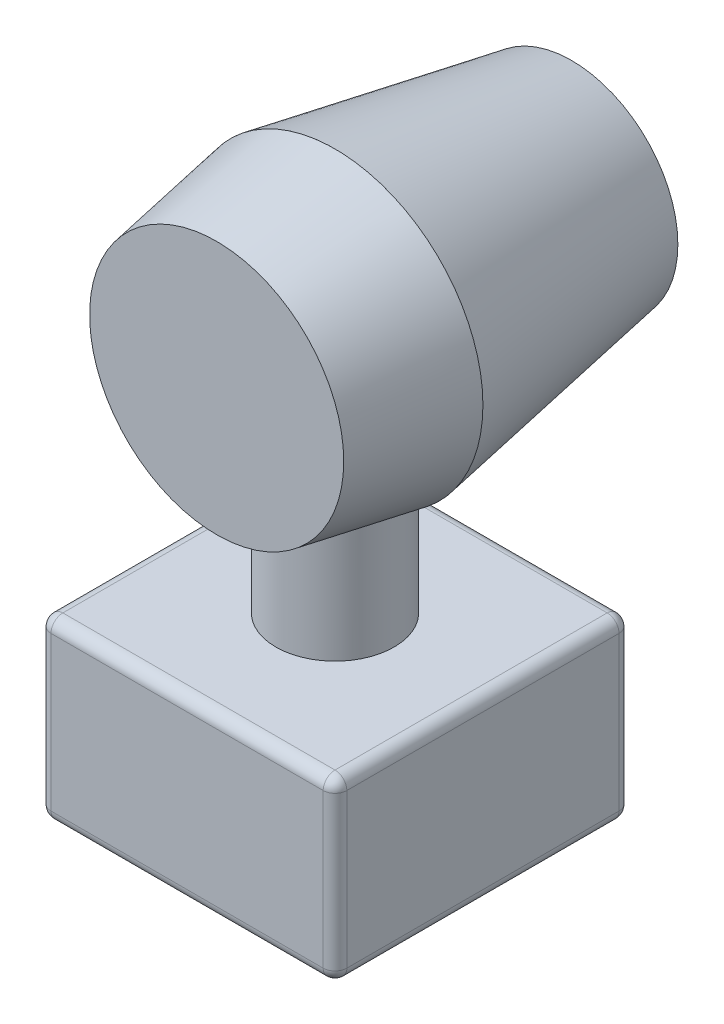
ISO-10303-21;
HEADER;
FILE_DESCRIPTION(('STEP AP214'),'2;1');
FILE_NAME('part.step','',(''),(''),'','','');
FILE_SCHEMA(('AUTOMOTIVE_DESIGN { 1 0 10303 214 1 1 1 1 }'));
ENDSEC;
DATA;
#1=APPLICATION_CONTEXT('core data for automotive mechanical design processes');
#2=APPLICATION_PROTOCOL_DEFINITION('international standard','automotive_design',2000,#1);
#3=PRODUCT_CONTEXT('',#1,'mechanical');
#4=PRODUCT('Part','Part','',(#3));
#5=PRODUCT_RELATED_PRODUCT_CATEGORY('part','',(#4));
#6=PRODUCT_DEFINITION_FORMATION('','',#4);
#7=PRODUCT_DEFINITION_CONTEXT('part definition',#1,'design');
#8=PRODUCT_DEFINITION('design','',#6,#7);
#9=PRODUCT_DEFINITION_SHAPE('','',#8);
#10=(LENGTH_UNIT() NAMED_UNIT(*) SI_UNIT(.MILLI.,.METRE.));
#11=(NAMED_UNIT(*) PLANE_ANGLE_UNIT() SI_UNIT($,.RADIAN.));
#12=(NAMED_UNIT(*) SI_UNIT($,.STERADIAN.) SOLID_ANGLE_UNIT());
#13=UNCERTAINTY_MEASURE_WITH_UNIT(LENGTH_MEASURE(1.E-05),#10,'distance_accuracy_value','');
#14=(GEOMETRIC_REPRESENTATION_CONTEXT(3) GLOBAL_UNCERTAINTY_ASSIGNED_CONTEXT((#13)) GLOBAL_UNIT_ASSIGNED_CONTEXT((#10,
#11,#12)) REPRESENTATION_CONTEXT('',''));
#15=CARTESIAN_POINT('',(0.,0.,0.));
#16=DIRECTION('',(0.,0.,1.));
#17=DIRECTION('',(1.,0.,0.));
#18=AXIS2_PLACEMENT_3D('',#15,#16,#17);
#19=CARTESIAN_POINT('',(0.,73.5493556629696,0.));
#20=DIRECTION('',(0.,0.,-1.));
#21=DIRECTION('',(1.,0.,0.));
#22=AXIS2_PLACEMENT_3D('',#19,#20,#21);
#23=CONICAL_SURFACE('',#22,31.75,0.174532925199433);
#24=CARTESIAN_POINT('',(0.,73.5493556629696,25.4));
#25=DIRECTION('',(0.,0.,1.));
#26=DIRECTION('',(1.,0.,0.));
#27=AXIS2_PLACEMENT_3D('',#24,#25,#26);
#28=CIRCLE('',#27,27.271294690005);
#29=CARTESIAN_POINT('',(27.271294690005,73.5493556629696,25.4));
#30=VERTEX_POINT('',#29);
#31=EDGE_CURVE('E11',#30,#30,#28,.T.);
#32=ORIENTED_EDGE('',*,*,#31,.F.);
#33=EDGE_LOOP('',(#32));
#34=FACE_BOUND('',#33,.T.);
#35=CARTESIAN_POINT('',(0.,73.5493556629696,0.));
#36=DIRECTION('',(0.,0.,1.));
#37=DIRECTION('',(1.,0.,0.));
#38=AXIS2_PLACEMENT_3D('',#35,#36,#37);
#39=CIRCLE('',#38,31.75);
#40=CARTESIAN_POINT('',(31.75,73.5493556629696,0.));
#41=VERTEX_POINT('',#40);
#42=EDGE_CURVE('E50',#41,#41,#39,.T.);
#43=ORIENTED_EDGE('',*,*,#42,.T.);
#44=EDGE_LOOP('',(#43));
#45=FACE_BOUND('',#44,.T.);
#46=ADVANCED_FACE('F44',(#34,#45),#23,.T.);
#47=CARTESIAN_POINT('',(0.,73.5493556629696,25.4));
#48=DIRECTION('',(0.,0.,1.));
#49=DIRECTION('',(1.,0.,0.));
#50=AXIS2_PLACEMENT_3D('',#47,#48,#49);
#51=PLANE('',#50);
#52=ORIENTED_EDGE('',*,*,#31,.T.);
#53=EDGE_LOOP('',(#52));
#54=FACE_BOUND('',#53,.T.);
#55=ADVANCED_FACE('F59',(#54),#51,.T.);
#56=CARTESIAN_POINT('',(0.,73.5493556629696,0.));
#57=DIRECTION('',(0.,0.,1.));
#58=DIRECTION('',(1.,0.,0.));
#59=AXIS2_PLACEMENT_3D('',#56,#57,#58);
#60=PLANE('',#59);
#61=ORIENTED_EDGE('',*,*,#42,.F.);
#62=EDGE_LOOP('',(#61));
#63=FACE_BOUND('',#62,.T.);
#64=ADVANCED_FACE('F57',(#63),#60,.F.);
#65=CLOSED_SHELL('',(#46,#55,#64));
#66=MANIFOLD_SOLID_BREP('B2',#65);
#67=CARTESIAN_POINT('',(0.,44.45,0.));
#68=DIRECTION('',(0.,1.,0.));
#69=DIRECTION('',(0.,0.,1.));
#70=AXIS2_PLACEMENT_3D('',#67,#68,#69);
#71=PLANE('',#70);
#72=CARTESIAN_POINT('',(19.002598434423,44.45,17.0390379885484));
#73=CARTESIAN_POINT('',(18.8235356701978,44.45,16.4838013348454));
#74=CARTESIAN_POINT('',(18.642875072393,44.45,15.9290807569523));
#75=CARTESIAN_POINT('',(18.2780705163189,44.45,14.8207795652394));
#76=CARTESIAN_POINT('',(18.0939265186836,44.45,14.267198964381));
#77=CARTESIAN_POINT('',(17.5356748101558,44.45,12.6078447674147));
#78=CARTESIAN_POINT('',(17.1559097199762,44.45,11.5039639724346));
#79=CARTESIAN_POINT('',(16.3712624910679,44.45,9.28229765231973));
#80=CARTESIAN_POINT('',(15.9660469235655,44.45,8.164629646743));
#81=CARTESIAN_POINT('',(15.1330443252617,44.45,5.93809957608098));
#82=CARTESIAN_POINT('',(14.7052648210868,44.45,4.82923471477085));
#83=CARTESIAN_POINT('',(14.0184426799052,44.45,3.11491452753809));
#84=CARTESIAN_POINT('',(13.7692380362429,44.45,2.50551509840848));
#85=CARTESIAN_POINT('',(13.2608116624823,44.45,1.29091564782306));
#86=CARTESIAN_POINT('',(13.0015901911441,44.45,0.685715518364401));
#87=CARTESIAN_POINT('',(12.4712439026292,44.45,-0.52029155772349));
#88=CARTESIAN_POINT('',(12.2001057240587,44.45,-1.12109264395197));
#89=CARTESIAN_POINT('',(11.6442031587002,44.45,-2.31634300503786));
#90=CARTESIAN_POINT('',(11.3594394831188,44.45,-2.91079260944496));
#91=CARTESIAN_POINT('',(10.7762146568556,44.45,-4.08654798742546));
#92=CARTESIAN_POINT('',(10.4778937305381,44.45,-4.66792304330012));
#93=CARTESIAN_POINT('',(9.86187387577617,44.45,-5.82056092326622));
#94=CARTESIAN_POINT('',(9.54417044593393,44.45,-6.39182135828593));
#95=CARTESIAN_POINT('',(8.88560430627156,44.45,-7.51935040451065));
#96=CARTESIAN_POINT('',(8.54478970730672,44.45,-8.07564698522348));
#97=CARTESIAN_POINT('',(7.83334417474321,44.45,-9.16872353177244));
#98=CARTESIAN_POINT('',(7.462732164141,44.45,-9.70551557441954));
#99=CARTESIAN_POINT('',(6.98345025852729,44.45,-10.3474341204733));
#100=CARTESIAN_POINT('',(6.89310450685243,44.45,-10.4663161320871));
#101=CARTESIAN_POINT('',(6.7102180950632,44.45,-10.7023918496696));
#102=CARTESIAN_POINT('',(6.61767730027151,44.45,-10.8195854513328));
#103=CARTESIAN_POINT('',(6.33649880558963,44.45,-11.1684425834167));
#104=CARTESIAN_POINT('',(6.14435919927044,44.45,-11.3973093976489));
#105=CARTESIAN_POINT('',(5.74989217261827,44.45,-11.8452450865516));
#106=CARTESIAN_POINT('',(5.54758782538117,44.45,-12.0643341935769));
#107=CARTESIAN_POINT('',(5.13095232315342,44.45,-12.4907672109988));
#108=CARTESIAN_POINT('',(4.91662355464813,44.45,-12.6981134357036));
#109=CARTESIAN_POINT('',(4.5192066936559,44.45,-13.0571388538163));
#110=CARTESIAN_POINT('',(4.3386222995621,44.45,-13.2115671284371));
#111=CARTESIAN_POINT('',(3.96798576401039,44.45,-13.5085804429791));
#112=CARTESIAN_POINT('',(3.77793131766287,44.45,-13.6511625769547));
#113=CARTESIAN_POINT('',(3.19317147870125,44.45,-14.0563864733166));
#114=CARTESIAN_POINT('',(2.78263175225813,44.45,-14.2976723554713));
#115=CARTESIAN_POINT('',(2.06614852418224,44.45,-14.6249236437101));
#116=CARTESIAN_POINT('',(1.77168356714644,44.45,-14.7358250064446));
#117=CARTESIAN_POINT('',(1.16858426735958,44.45,-14.9083229723135));
#118=CARTESIAN_POINT('',(0.859969405831298,44.45,-14.9699853316713));
#119=CARTESIAN_POINT('',(0.234584305056036,44.45,-15.0367489482161));
#120=CARTESIAN_POINT('',(-0.0822239178371466,44.45,-15.0415065347739));
#121=CARTESIAN_POINT('',(-0.711398138640903,44.45,-14.992909222197));
#122=CARTESIAN_POINT('',(-1.0237606384265,44.45,-14.9395108748984));
#123=CARTESIAN_POINT('',(-1.68871762676761,44.45,-14.76744423248));
#124=CARTESIAN_POINT('',(-2.03870800883725,44.45,-14.6389363686106));
#125=CARTESIAN_POINT('',(-2.71350949733138,44.45,-14.3276448374468));
#126=CARTESIAN_POINT('',(-3.03827056358923,44.45,-14.1447566117743));
#127=CARTESIAN_POINT('',(-3.61753903498474,44.45,-13.7690139972569));
#128=CARTESIAN_POINT('',(-3.87546298373163,44.45,-13.5812933482752));
#129=CARTESIAN_POINT('',(-4.37428668507126,44.45,-13.1842638341636));
#130=CARTESIAN_POINT('',(-4.6151723541688,44.45,-12.9749374536329));
#131=CARTESIAN_POINT('',(-5.08237564353212,44.45,-12.5394656587436));
#132=CARTESIAN_POINT('',(-5.30864898790133,44.45,-12.3132732269763));
#133=CARTESIAN_POINT('',(-5.74776332590007,44.45,-11.8484622124256));
#134=CARTESIAN_POINT('',(-5.9606092458098,44.45,-11.609848246215));
#135=CARTESIAN_POINT('',(-6.50261079616479,44.45,-10.9725455899704));
#136=CARTESIAN_POINT('',(-6.82246527119225,44.45,-10.5659617006645));
#137=CARTESIAN_POINT('',(-7.43817192412713,44.45,-9.73489068181692));
#138=CARTESIAN_POINT('',(-7.73400942356082,44.45,-9.31039284107437));
#139=CARTESIAN_POINT('',(-8.3066428327371,44.45,-8.44750077930655));
#140=CARTESIAN_POINT('',(-8.58339644577073,44.45,-8.00907864937679));
#141=CARTESIAN_POINT('',(-9.12053275086414,44.45,-7.12251259445784));
#142=CARTESIAN_POINT('',(-9.38091907271994,44.45,-6.67437085486298));
#143=CARTESIAN_POINT('',(-9.89010350026338,44.45,-5.76672526820276));
#144=CARTESIAN_POINT('',(-10.1387885415585,44.45,-5.30715825071471));
#145=CARTESIAN_POINT('',(-10.624356797639,44.45,-4.38182601774382));
#146=CARTESIAN_POINT('',(-10.8612394588333,44.45,-3.91606051281661));
#147=CARTESIAN_POINT('',(-11.324545280009,44.45,-2.98010944294724));
#148=CARTESIAN_POINT('',(-11.5509814026551,44.45,-2.50993027750393));
#149=CARTESIAN_POINT('',(-11.9950352505992,44.45,-1.56542057686625));
#150=CARTESIAN_POINT('',(-12.2126527158999,44.45,-1.09108991977561));
#151=CARTESIAN_POINT('',(-12.7531247828579,44.45,0.112654821795878));
#152=CARTESIAN_POINT('',(-13.070811583501,44.45,0.844389390425289));
#153=CARTESIAN_POINT('',(-13.6911454543776,44.45,2.3142089353253));
#154=CARTESIAN_POINT('',(-13.993791921178,44.45,3.05229416499927));
#155=CARTESIAN_POINT('',(-14.5865217695328,44.45,4.53404785641916));
#156=CARTESIAN_POINT('',(-14.8765966967587,44.45,5.27771969255583));
#157=CARTESIAN_POINT('',(-15.4457774420459,44.45,6.76924945936397));
#158=CARTESIAN_POINT('',(-15.7248831305279,44.45,7.51710743936702));
#159=CARTESIAN_POINT('',(-16.2649616723054,44.45,8.99281338744412));
#160=CARTESIAN_POINT('',(-16.5262286726568,44.45,9.72055391047006));
#161=CARTESIAN_POINT('',(-17.0408809174255,44.45,11.1788211167349));
#162=CARTESIAN_POINT('',(-17.2942660832547,44.45,11.9093478276727));
#163=CARTESIAN_POINT('',(-17.7937359285202,44.45,13.3718963366204));
#164=CARTESIAN_POINT('',(-18.039829116388,44.45,14.1039152336113));
#165=CARTESIAN_POINT('',(-18.5257399581867,44.45,15.5700059985712));
#166=CARTESIAN_POINT('',(-18.7655578286105,44.45,16.3040777947473));
#167=CARTESIAN_POINT('',(-19.002598434423,44.45,17.0390379885484));
#168=B_SPLINE_CURVE_WITH_KNOTS('',3,(#72,#73,#74,#75,#76,#77,#78,#79,#80,#81,#82,#83,#84,#85,
#86,#87,#88,#89,#90,#91,#92,#93,#94,#95,#96,#97,#98,#99,#100,#101,#102,#103,#104,#105,#106,#107,
#108,#109,#110,#111,#112,#113,#114,#115,#116,#117,#118,#119,#120,#121,#122,#123,#124,#125,#126,
#127,#128,#129,#130,#131,#132,#133,#134,#135,#136,#137,#138,#139,#140,#141,#142,#143,#144,#145,
#146,#147,#148,#149,#150,#151,#152,#153,#154,#155,#156,#157,#158,#159,#160,#161,#162,#163,#164,
#165,#166,#167),.UNSPECIFIED.,.F.,.F.,(4,2,2,2,2,2,2,2,2,2,2,2,2,2,2,2,2,2,2,2,2,2,2,2,2,2,2,2,
2,2,2,2,2,2,2,2,2,2,2,2,2,2,2,2,2,2,2,4),(0.,1.75018385469058,3.5003875001438,7.00238658243701,
10.5687748039476,14.1339808214411,16.1090639468169,18.084096084827,20.0614021939357,
22.0386052064399,23.9986593033936,25.9591703495778,27.9157185364648,29.8710338757038,
30.3189619285398,30.7669175355458,31.6631014433263,32.5573356909736,33.4513930836335,
34.1637441297835,34.8762694080991,36.2962541757734,37.2368564146324,38.1762004156768,
39.1212146454989,40.0669353778864,41.1792276220366,42.2936724797234,43.2493127579916,
44.2057339349019,45.1649288953608,46.1237698729368,47.6744524817328,49.2260757972553,
50.78103432244,52.3356467767956,53.9030592395204,55.4705451527083,57.0360306313456,
58.6015622310803,60.9945074368707,63.3875485726349,65.7821748122243,68.176829330935,
70.4964339504994,72.8160616909419,75.1328667826272,77.4495918409293),.UNSPECIFIED.);
#169=CARTESIAN_POINT('',(12.7,44.45,0.));
#170=VERTEX_POINT('',#169);
#171=CARTESIAN_POINT('',(6.58552110472751,44.45,-10.85913955059));
#172=VERTEX_POINT('',#171);
#173=EDGE_CURVE('E42',#170,#172,#168,.T.);
#174=ORIENTED_EDGE('',*,*,#173,.F.);
#175=CARTESIAN_POINT('',(0.,44.45,0.));
#176=DIRECTION('',(0.,1.,0.));
#177=DIRECTION('',(0.,0.,1.));
#178=AXIS2_PLACEMENT_3D('',#175,#176,#177);
#179=CIRCLE('',#178,12.7);
#180=EDGE_CURVE('E129',#170,#172,#179,.T.);
#181=ORIENTED_EDGE('',*,*,#180,.T.);
#182=EDGE_LOOP('',(#174,#181));
#183=FACE_BOUND('',#182,.T.);
#184=ADVANCED_FACE('F94',(#183),#71,.T.);
#185=CARTESIAN_POINT('',(-6.58552110472751,44.45,-10.85913955059));
#186=VERTEX_POINT('',#185);
#187=CARTESIAN_POINT('',(-12.7,44.45,0.));
#188=VERTEX_POINT('',#187);
#189=EDGE_CURVE('E99',#186,#188,#168,.T.);
#190=ORIENTED_EDGE('',*,*,#189,.F.);
#191=EDGE_CURVE('E136',#186,#188,#179,.T.);
#192=ORIENTED_EDGE('',*,*,#191,.T.);
#193=EDGE_LOOP('',(#190,#192));
#194=FACE_BOUND('',#193,.T.);
#195=ADVANCED_FACE('F166',(#194),#71,.T.);
#196=CARTESIAN_POINT('',(0.,44.45,0.));
#197=DIRECTION('',(0.,-1.,0.));
#198=DIRECTION('',(0.,0.,-1.));
#199=AXIS2_PLACEMENT_3D('',#196,#197,#198);
#200=CYLINDRICAL_SURFACE('',#199,12.7);
#201=ORIENTED_EDGE('',*,*,#191,.F.);
#202=CARTESIAN_POINT('',(-6.58723513670905,44.4502,-10.858099891496));
#203=CARTESIAN_POINT('',(-6.28715595878836,44.4151470842248,-11.0401826445789));
#204=CARTESIAN_POINT('',(-5.97942414268513,44.3808451259637,-11.2098192707049));
#205=CARTESIAN_POINT('',(-5.35068834678258,44.3151740220028,-11.523164495913));
#206=CARTESIAN_POINT('',(-5.02968282300718,44.2838052188746,-11.6668700682501));
#207=CARTESIAN_POINT('',(-4.37655366359621,44.2254446346864,-11.9272545212879));
#208=CARTESIAN_POINT('',(-4.04443173649173,44.1984521846976,-12.0439375335775));
#209=CARTESIAN_POINT('',(-3.3712932141469,44.1500066256437,-12.2494159496166));
#210=CARTESIAN_POINT('',(-3.03027718362225,44.1285531658282,-12.3382131192836));
#211=CARTESIAN_POINT('',(-2.34124785900934,44.09208608428,-12.4873124327811));
#212=CARTESIAN_POINT('',(-1.99322582050275,44.0770811095369,-12.5475763263265));
#213=CARTESIAN_POINT('',(-1.29314241617467,44.0541965246121,-12.6389237047044));
#214=CARTESIAN_POINT('',(-0.941081112013119,44.0463168058087,-12.6700076343747));
#215=CARTESIAN_POINT('',(-0.235594220377219,44.0380209961298,-12.7027225138189));
#216=CARTESIAN_POINT('',(0.117830995159614,44.0376029969739,-12.7043609940528));
#217=CARTESIAN_POINT('',(0.82350185036923,44.04424366228,-12.6781899509261));
#218=CARTESIAN_POINT('',(1.17574754788317,44.0513019545699,-12.6503818934234));
#219=CARTESIAN_POINT('',(1.87046796847227,44.0724090795072,-12.5662913077677));
#220=CARTESIAN_POINT('',(2.21300667044762,44.0863359799323,-12.5105051674009));
#221=CARTESIAN_POINT('',(2.89210658960558,44.1205436965626,-12.3711711949881));
#222=CARTESIAN_POINT('',(3.22866712331181,44.1408252344073,-12.2876202098711));
#223=CARTESIAN_POINT('',(3.89316884817987,44.1868742673649,-12.0935088137227));
#224=CARTESIAN_POINT('',(4.22111765827,44.2126367161801,-11.9829732338074));
#225=CARTESIAN_POINT('',(4.86645543095027,44.2685671556545,-11.7357117086253));
#226=CARTESIAN_POINT('',(5.18384919507351,44.2987331085281,-11.5989978686552));
#227=CARTESIAN_POINT('',(5.68195926716964,44.3495166463859,-11.3599465134536));
#228=CARTESIAN_POINT('',(5.86668466318433,44.3691421019248,-11.2656551410557));
#229=CARTESIAN_POINT('',(6.23088734626099,44.4091637484152,-11.0683716261889));
#230=CARTESIAN_POINT('',(6.41037390847478,44.4295584095852,-10.965396297016));
#231=CARTESIAN_POINT('',(6.58723513670905,44.4502,-10.858099891496));
#232=B_SPLINE_CURVE_WITH_KNOTS('',3,(#202,#203,#204,#205,#206,#207,#208,#209,#210,#211,#212,
#213,#214,#215,#216,#217,#218,#219,#220,#221,#222,#223,#224,#225,#226,#227,#228,#229,#230,#231),
.UNSPECIFIED.,.F.,.F.,(4,2,2,2,2,2,2,2,2,2,2,2,2,2,4),(0.,1.05795827578068,2.11603995963392,
3.17395976212471,4.23181255657099,5.29107946841862,6.35033023187104,7.40931009577438,
8.46823724580884,9.50900841408701,10.5498978163178,11.5898329829565,12.6292884211968,
13.254038474305,13.8776055410348),.UNSPECIFIED.);
#233=EDGE_CURVE('E133',#186,#172,#232,.T.);
#234=ORIENTED_EDGE('',*,*,#233,.T.);
#235=ORIENTED_EDGE('',*,*,#180,.F.);
#236=EDGE_CURVE('E131',#188,#170,#179,.T.);
#237=ORIENTED_EDGE('',*,*,#236,.F.);
#238=EDGE_LOOP('',(#201,#234,#235,#237));
#239=FACE_BOUND('',#238,.T.);
#240=CARTESIAN_POINT('',(0.,19.05,0.));
#241=DIRECTION('',(0.,1.,0.));
#242=DIRECTION('',(0.,0.,1.));
#243=AXIS2_PLACEMENT_3D('',#240,#241,#242);
#244=CIRCLE('',#243,12.7);
#245=CARTESIAN_POINT('',(0.,19.05,12.7));
#246=VERTEX_POINT('',#245);
#247=EDGE_CURVE('E139',#246,#246,#244,.T.);
#248=ORIENTED_EDGE('',*,*,#247,.T.);
#249=EDGE_LOOP('',(#248));
#250=FACE_BOUND('',#249,.T.);
#251=ADVANCED_FACE('F96',(#239,#250),#200,.T.);
#252=DIRECTION('',(1.,0.,0.));
#253=VECTOR('',#252,1.);
#254=CARTESIAN_POINT('',(0.,44.45,0.));
#255=LINE('',#254,#253);
#256=EDGE_CURVE('E114',#188,#170,#255,.T.);
#257=ORIENTED_EDGE('',*,*,#256,.F.);
#258=ORIENTED_EDGE('',*,*,#236,.T.);
#259=EDGE_LOOP('',(#257,#258));
#260=FACE_BOUND('',#259,.T.);
#261=ADVANCED_FACE('F138',(#260),#71,.T.);
#262=CARTESIAN_POINT('',(0.,19.05,0.));
#263=DIRECTION('',(0.,1.,0.));
#264=DIRECTION('',(0.,0.,1.));
#265=AXIS2_PLACEMENT_3D('',#262,#263,#264);
#266=PLANE('',#265);
#267=ORIENTED_EDGE('',*,*,#247,.F.);
#268=EDGE_LOOP('',(#267));
#269=FACE_BOUND('',#268,.T.);
#270=ADVANCED_FACE('F160',(#269),#266,.F.);
#271=CARTESIAN_POINT('',(0.,73.5493556629696,0.));
#272=DIRECTION('',(0.,0.,1.));
#273=DIRECTION('',(1.,0.,0.));
#274=AXIS2_PLACEMENT_3D('',#271,#272,#273);
#275=CONICAL_SURFACE('',#274,31.75,0.174532925199433);
#276=CARTESIAN_POINT('',(0.,73.5493556629696,-50.8));
#277=DIRECTION('',(0.,0.,1.));
#278=DIRECTION('',(1.,0.,0.));
#279=AXIS2_PLACEMENT_3D('',#276,#277,#278);
#280=CIRCLE('',#279,22.79258938001);
#281=CARTESIAN_POINT('',(22.79258938001,73.5493556629696,-50.8));
#282=VERTEX_POINT('',#281);
#283=EDGE_CURVE('E147',#282,#282,#280,.T.);
#284=ORIENTED_EDGE('',*,*,#283,.T.);
#285=EDGE_LOOP('',(#284));
#286=FACE_BOUND('',#285,.T.);
#287=CARTESIAN_POINT('',(0.,73.5493556629696,0.));
#288=DIRECTION('',(0.,0.,1.));
#289=DIRECTION('',(1.,0.,0.));
#290=AXIS2_PLACEMENT_3D('',#287,#288,#289);
#291=CIRCLE('',#290,31.75);
#292=EDGE_CURVE('E145',#170,#188,#291,.T.);
#293=ORIENTED_EDGE('',*,*,#292,.F.);
#294=ORIENTED_EDGE('',*,*,#173,.T.);
#295=ORIENTED_EDGE('',*,*,#233,.F.);
#296=ORIENTED_EDGE('',*,*,#189,.T.);
#297=EDGE_LOOP('',(#293,#294,#295,#296));
#298=FACE_BOUND('',#297,.T.);
#299=ADVANCED_FACE('F146',(#286,#298),#275,.T.);
#300=CARTESIAN_POINT('',(0.,73.5493556629696,-50.8));
#301=DIRECTION('',(0.,0.,1.));
#302=DIRECTION('',(1.,0.,0.));
#303=AXIS2_PLACEMENT_3D('',#300,#301,#302);
#304=PLANE('',#303);
#305=ORIENTED_EDGE('',*,*,#283,.F.);
#306=EDGE_LOOP('',(#305));
#307=FACE_BOUND('',#306,.T.);
#308=ADVANCED_FACE('F159',(#307),#304,.F.);
#309=CARTESIAN_POINT('',(0.,73.5493556629696,0.));
#310=DIRECTION('',(0.,0.,1.));
#311=DIRECTION('',(1.,0.,0.));
#312=AXIS2_PLACEMENT_3D('',#309,#310,#311);
#313=PLANE('',#312);
#314=ORIENTED_EDGE('',*,*,#292,.T.);
#315=ORIENTED_EDGE('',*,*,#256,.T.);
#316=EDGE_LOOP('',(#314,#315));
#317=FACE_BOUND('',#316,.T.);
#318=ADVANCED_FACE('F144',(#317),#313,.T.);
#319=CLOSED_SHELL('',(#184,#195,#251,#261,#270,#299,#308,#318));
#320=MANIFOLD_SOLID_BREP('B6',#319);
#321=CARTESIAN_POINT('',(31.75,-19.05,31.75));
#322=DIRECTION('',(-1.,0.,0.));
#323=DIRECTION('',(0.,0.,1.));
#324=AXIS2_PLACEMENT_3D('',#321,#322,#323);
#325=PLANE('',#324);
#326=DIRECTION('',(0.,1.,0.));
#327=VECTOR('',#326,1.);
#328=CARTESIAN_POINT('',(31.75,-19.05,29.21));
#329=LINE('',#328,#327);
#330=CARTESIAN_POINT('',(31.75,16.51,29.21));
#331=VERTEX_POINT('',#330);
#332=CARTESIAN_POINT('',(31.75,-16.51,29.21));
#333=VERTEX_POINT('',#332);
#334=EDGE_CURVE('E380',#331,#333,#329,.F.);
#335=ORIENTED_EDGE('',*,*,#334,.T.);
#336=DIRECTION('',(0.,0.,-1.));
#337=VECTOR('',#336,1.);
#338=CARTESIAN_POINT('',(31.75,-16.51,31.75));
#339=LINE('',#338,#337);
#340=CARTESIAN_POINT('',(31.75,-16.51,-29.21));
#341=VERTEX_POINT('',#340);
#342=EDGE_CURVE('E383',#333,#341,#339,.T.);
#343=ORIENTED_EDGE('',*,*,#342,.T.);
#344=DIRECTION('',(0.,1.,0.));
#345=VECTOR('',#344,1.);
#346=CARTESIAN_POINT('',(31.75,19.05,-29.21));
#347=LINE('',#346,#345);
#348=CARTESIAN_POINT('',(31.75,16.51,-29.21));
#349=VERTEX_POINT('',#348);
#350=EDGE_CURVE('E378',#341,#349,#347,.T.);
#351=ORIENTED_EDGE('',*,*,#350,.T.);
#352=DIRECTION('',(0.,0.,-1.));
#353=VECTOR('',#352,1.);
#354=CARTESIAN_POINT('',(31.75,16.51,31.75));
#355=LINE('',#354,#353);
#356=EDGE_CURVE('E376',#349,#331,#355,.F.);
#357=ORIENTED_EDGE('',*,*,#356,.T.);
#358=EDGE_LOOP('',(#335,#343,#351,#357));
#359=FACE_BOUND('',#358,.T.);
#360=ADVANCED_FACE('F229',(#359),#325,.F.);
#361=CARTESIAN_POINT('',(-31.75,19.05,31.75));
#362=DIRECTION('',(0.,-1.,0.));
#363=DIRECTION('',(0.,0.,-1.));
#364=AXIS2_PLACEMENT_3D('',#361,#362,#363);
#365=PLANE('',#364);
#366=DIRECTION('',(-1.,0.,0.));
#367=VECTOR('',#366,1.);
#368=CARTESIAN_POINT('',(-31.75,19.05,29.21));
#369=LINE('',#368,#367);
#370=CARTESIAN_POINT('',(-29.21,19.05,29.21));
#371=VERTEX_POINT('',#370);
#372=CARTESIAN_POINT('',(29.21,19.05,29.21));
#373=VERTEX_POINT('',#372);
#374=EDGE_CURVE('E238',#371,#373,#369,.F.);
#375=ORIENTED_EDGE('',*,*,#374,.T.);
#376=DIRECTION('',(0.,0.,-1.));
#377=VECTOR('',#376,1.);
#378=CARTESIAN_POINT('',(29.21,19.05,31.75));
#379=LINE('',#378,#377);
#380=CARTESIAN_POINT('',(29.21,19.05,-29.21));
#381=VERTEX_POINT('',#380);
#382=EDGE_CURVE('E92',#373,#381,#379,.T.);
#383=ORIENTED_EDGE('',*,*,#382,.T.);
#384=DIRECTION('',(-1.,0.,0.));
#385=VECTOR('',#384,1.);
#386=CARTESIAN_POINT('',(-31.75,19.05,-29.21));
#387=LINE('',#386,#385);
#388=CARTESIAN_POINT('',(-29.21,19.05,-29.21));
#389=VERTEX_POINT('',#388);
#390=EDGE_CURVE('E394',#381,#389,#387,.T.);
#391=ORIENTED_EDGE('',*,*,#390,.T.);
#392=DIRECTION('',(0.,0.,-1.));
#393=VECTOR('',#392,1.);
#394=CARTESIAN_POINT('',(-29.21,19.05,31.75));
#395=LINE('',#394,#393);
#396=EDGE_CURVE('E249',#389,#371,#395,.F.);
#397=ORIENTED_EDGE('',*,*,#396,.T.);
#398=EDGE_LOOP('',(#375,#383,#391,#397));
#399=FACE_BOUND('',#398,.T.);
#400=ADVANCED_FACE('F483',(#399),#365,.F.);
#401=CARTESIAN_POINT('',(-31.75,-19.05,31.75));
#402=DIRECTION('',(1.,0.,0.));
#403=DIRECTION('',(0.,0.,-1.));
#404=AXIS2_PLACEMENT_3D('',#401,#402,#403);
#405=PLANE('',#404);
#406=DIRECTION('',(0.,-1.,0.));
#407=VECTOR('',#406,1.);
#408=CARTESIAN_POINT('',(-31.75,-19.05,-29.21));
#409=LINE('',#408,#407);
#410=CARTESIAN_POINT('',(-31.75,16.51,-29.21));
#411=VERTEX_POINT('',#410);
#412=CARTESIAN_POINT('',(-31.75,-16.51,-29.21));
#413=VERTEX_POINT('',#412);
#414=EDGE_CURVE('E328',#411,#413,#409,.T.);
#415=ORIENTED_EDGE('',*,*,#414,.T.);
#416=DIRECTION('',(0.,0.,-1.));
#417=VECTOR('',#416,1.);
#418=CARTESIAN_POINT('',(-31.75,-16.51,31.75));
#419=LINE('',#418,#417);
#420=CARTESIAN_POINT('',(-31.75,-16.51,29.21));
#421=VERTEX_POINT('',#420);
#422=EDGE_CURVE('E324',#413,#421,#419,.F.);
#423=ORIENTED_EDGE('',*,*,#422,.T.);
#424=DIRECTION('',(0.,-1.,0.));
#425=VECTOR('',#424,1.);
#426=CARTESIAN_POINT('',(-31.75,-19.05,29.21));
#427=LINE('',#426,#425);
#428=CARTESIAN_POINT('',(-31.75,16.51,29.21));
#429=VERTEX_POINT('',#428);
#430=EDGE_CURVE('E316',#421,#429,#427,.F.);
#431=ORIENTED_EDGE('',*,*,#430,.T.);
#432=DIRECTION('',(0.,0.,-1.));
#433=VECTOR('',#432,1.);
#434=CARTESIAN_POINT('',(-31.75,16.51,31.75));
#435=LINE('',#434,#433);
#436=EDGE_CURVE('E321',#429,#411,#435,.T.);
#437=ORIENTED_EDGE('',*,*,#436,.T.);
#438=EDGE_LOOP('',(#415,#423,#431,#437));
#439=FACE_BOUND('',#438,.T.);
#440=ADVANCED_FACE('F319',(#439),#405,.F.);
#441=CARTESIAN_POINT('',(-31.75,-19.05,31.75));
#442=DIRECTION('',(0.,1.,0.));
#443=DIRECTION('',(0.,0.,1.));
#444=AXIS2_PLACEMENT_3D('',#441,#442,#443);
#445=PLANE('',#444);
#446=DIRECTION('',(1.,0.,0.));
#447=VECTOR('',#446,1.);
#448=CARTESIAN_POINT('',(-31.75,-19.05,29.21));
#449=LINE('',#448,#447);
#450=CARTESIAN_POINT('',(29.21,-19.05,29.21));
#451=VERTEX_POINT('',#450);
#452=CARTESIAN_POINT('',(-29.21,-19.05,29.21));
#453=VERTEX_POINT('',#452);
#454=EDGE_CURVE('E389',#451,#453,#449,.F.);
#455=ORIENTED_EDGE('',*,*,#454,.T.);
#456=DIRECTION('',(0.,0.,-1.));
#457=VECTOR('',#456,1.);
#458=CARTESIAN_POINT('',(-29.21,-19.05,31.75));
#459=LINE('',#458,#457);
#460=CARTESIAN_POINT('',(-29.21,-19.05,-29.21));
#461=VERTEX_POINT('',#460);
#462=EDGE_CURVE('E391',#453,#461,#459,.T.);
#463=ORIENTED_EDGE('',*,*,#462,.T.);
#464=DIRECTION('',(1.,0.,0.));
#465=VECTOR('',#464,1.);
#466=CARTESIAN_POINT('',(31.75,-19.05,-29.21));
#467=LINE('',#466,#465);
#468=CARTESIAN_POINT('',(29.21,-19.05,-29.21));
#469=VERTEX_POINT('',#468);
#470=EDGE_CURVE('E385',#461,#469,#467,.T.);
#471=ORIENTED_EDGE('',*,*,#470,.T.);
#472=DIRECTION('',(0.,0.,-1.));
#473=VECTOR('',#472,1.);
#474=CARTESIAN_POINT('',(29.21,-19.05,31.75));
#475=LINE('',#474,#473);
#476=EDGE_CURVE('E387',#469,#451,#475,.F.);
#477=ORIENTED_EDGE('',*,*,#476,.T.);
#478=EDGE_LOOP('',(#455,#463,#471,#477));
#479=FACE_BOUND('',#478,.T.);
#480=ADVANCED_FACE('F460',(#479),#445,.F.);
#481=CARTESIAN_POINT('',(31.75,19.05,31.75));
#482=DIRECTION('',(0.,0.,-1.));
#483=DIRECTION('',(-1.,0.,0.));
#484=AXIS2_PLACEMENT_3D('',#481,#482,#483);
#485=PLANE('',#484);
#486=DIRECTION('',(0.,-1.,0.));
#487=VECTOR('',#486,1.);
#488=CARTESIAN_POINT('',(-29.21,19.05,31.75));
#489=LINE('',#488,#487);
#490=CARTESIAN_POINT('',(-29.21,16.51,31.75));
#491=VERTEX_POINT('',#490);
#492=CARTESIAN_POINT('',(-29.21,-16.51,31.75));
#493=VERTEX_POINT('',#492);
#494=EDGE_CURVE('E336',#491,#493,#489,.T.);
#495=ORIENTED_EDGE('',*,*,#494,.T.);
#496=DIRECTION('',(1.,0.,0.));
#497=VECTOR('',#496,1.);
#498=CARTESIAN_POINT('',(31.75,-16.51,31.75));
#499=LINE('',#498,#497);
#500=CARTESIAN_POINT('',(29.21,-16.51,31.75));
#501=VERTEX_POINT('',#500);
#502=EDGE_CURVE('E374',#493,#501,#499,.T.);
#503=ORIENTED_EDGE('',*,*,#502,.T.);
#504=DIRECTION('',(0.,1.,0.));
#505=VECTOR('',#504,1.);
#506=CARTESIAN_POINT('',(29.21,19.05,31.75));
#507=LINE('',#506,#505);
#508=CARTESIAN_POINT('',(29.21,16.51,31.75));
#509=VERTEX_POINT('',#508);
#510=EDGE_CURVE('E371',#501,#509,#507,.T.);
#511=ORIENTED_EDGE('',*,*,#510,.T.);
#512=DIRECTION('',(-1.,0.,0.));
#513=VECTOR('',#512,1.);
#514=CARTESIAN_POINT('',(31.75,16.51,31.75));
#515=LINE('',#514,#513);
#516=EDGE_CURVE('E369',#509,#491,#515,.T.);
#517=ORIENTED_EDGE('',*,*,#516,.T.);
#518=EDGE_LOOP('',(#495,#503,#511,#517));
#519=FACE_BOUND('',#518,.T.);
#520=ADVANCED_FACE('F672',(#519),#485,.F.);
#521=CARTESIAN_POINT('',(31.75,19.05,-31.75));
#522=DIRECTION('',(0.,0.,-1.));
#523=DIRECTION('',(-1.,0.,0.));
#524=AXIS2_PLACEMENT_3D('',#521,#522,#523);
#525=PLANE('',#524);
#526=DIRECTION('',(0.,1.,0.));
#527=VECTOR('',#526,1.);
#528=CARTESIAN_POINT('',(29.21,-19.05,-31.75));
#529=LINE('',#528,#527);
#530=CARTESIAN_POINT('',(29.21,16.51,-31.75));
#531=VERTEX_POINT('',#530);
#532=CARTESIAN_POINT('',(29.21,-16.51,-31.75));
#533=VERTEX_POINT('',#532);
#534=EDGE_CURVE('E362',#531,#533,#529,.F.);
#535=ORIENTED_EDGE('',*,*,#534,.T.);
#536=DIRECTION('',(1.,0.,0.));
#537=VECTOR('',#536,1.);
#538=CARTESIAN_POINT('',(-31.75,-16.51,-31.75));
#539=LINE('',#538,#537);
#540=CARTESIAN_POINT('',(-29.21,-16.51,-31.75));
#541=VERTEX_POINT('',#540);
#542=EDGE_CURVE('E367',#533,#541,#539,.F.);
#543=ORIENTED_EDGE('',*,*,#542,.T.);
#544=DIRECTION('',(0.,-1.,0.));
#545=VECTOR('',#544,1.);
#546=CARTESIAN_POINT('',(-29.21,19.05,-31.75));
#547=LINE('',#546,#545);
#548=CARTESIAN_POINT('',(-29.21,16.51,-31.75));
#549=VERTEX_POINT('',#548);
#550=EDGE_CURVE('E364',#541,#549,#547,.F.);
#551=ORIENTED_EDGE('',*,*,#550,.T.);
#552=DIRECTION('',(-1.,0.,0.));
#553=VECTOR('',#552,1.);
#554=CARTESIAN_POINT('',(31.75,16.51,-31.75));
#555=LINE('',#554,#553);
#556=EDGE_CURVE('E360',#549,#531,#555,.F.);
#557=ORIENTED_EDGE('',*,*,#556,.T.);
#558=EDGE_LOOP('',(#535,#543,#551,#557));
#559=FACE_BOUND('',#558,.T.);
#560=ADVANCED_FACE('F665',(#559),#525,.T.);
#561=CARTESIAN_POINT('',(29.21,19.05,29.21));
#562=DIRECTION('',(0.,1.,0.));
#563=DIRECTION('',(0.,0.,1.));
#564=AXIS2_PLACEMENT_3D('',#561,#562,#563);
#565=CYLINDRICAL_SURFACE('',#564,2.54);
#566=CARTESIAN_POINT('',(29.21,16.51,29.21));
#567=DIRECTION('',(0.,1.,0.));
#568=DIRECTION('',(0.,0.,1.));
#569=AXIS2_PLACEMENT_3D('',#566,#567,#568);
#570=CIRCLE('',#569,2.54);
#571=EDGE_CURVE('E233',#509,#331,#570,.T.);
#572=ORIENTED_EDGE('',*,*,#571,.F.);
#573=ORIENTED_EDGE('',*,*,#510,.F.);
#574=CARTESIAN_POINT('',(29.21,-16.51,29.21));
#575=DIRECTION('',(0.,-1.,0.));
#576=DIRECTION('',(0.,0.,-1.));
#577=AXIS2_PLACEMENT_3D('',#574,#575,#576);
#578=CIRCLE('',#577,2.54);
#579=EDGE_CURVE('E356',#333,#501,#578,.T.);
#580=ORIENTED_EDGE('',*,*,#579,.F.);
#581=ORIENTED_EDGE('',*,*,#334,.F.);
#582=EDGE_LOOP('',(#572,#573,#580,#581));
#583=FACE_BOUND('',#582,.T.);
#584=ADVANCED_FACE('F231',(#583),#565,.T.);
#585=CARTESIAN_POINT('',(29.21,16.51,29.21));
#586=DIRECTION('',(0.,0.,1.));
#587=DIRECTION('',(1.,0.,0.));
#588=AXIS2_PLACEMENT_3D('',#585,#586,#587);
#589=SPHERICAL_SURFACE('',#588,2.54);
#590=CARTESIAN_POINT('',(29.21,16.51,29.21));
#591=DIRECTION('',(1.,0.,0.));
#592=DIRECTION('',(0.,0.,-1.));
#593=AXIS2_PLACEMENT_3D('',#590,#591,#592);
#594=CIRCLE('',#593,2.54);
#595=EDGE_CURVE('E440',#509,#373,#594,.F.);
#596=ORIENTED_EDGE('',*,*,#595,.F.);
#597=ORIENTED_EDGE('',*,*,#571,.T.);
#598=CARTESIAN_POINT('',(29.21,16.51,29.21));
#599=DIRECTION('',(0.,0.,1.));
#600=DIRECTION('',(1.,0.,0.));
#601=AXIS2_PLACEMENT_3D('',#598,#599,#600);
#602=CIRCLE('',#601,2.54);
#603=EDGE_CURVE('E442',#373,#331,#602,.F.);
#604=ORIENTED_EDGE('',*,*,#603,.F.);
#605=EDGE_LOOP('',(#596,#597,#604));
#606=FACE_BOUND('',#605,.T.);
#607=ADVANCED_FACE('F650',(#606),#589,.T.);
#608=CARTESIAN_POINT('',(29.21,-16.51,29.21));
#609=DIRECTION('',(0.,0.,1.));
#610=DIRECTION('',(1.,0.,0.));
#611=AXIS2_PLACEMENT_3D('',#608,#609,#610);
#612=SPHERICAL_SURFACE('',#611,2.54);
#613=CARTESIAN_POINT('',(29.21,-16.51,29.21));
#614=DIRECTION('',(0.,0.,1.));
#615=DIRECTION('',(1.,0.,0.));
#616=AXIS2_PLACEMENT_3D('',#613,#614,#615);
#617=CIRCLE('',#616,2.54);
#618=EDGE_CURVE('E434',#333,#451,#617,.F.);
#619=ORIENTED_EDGE('',*,*,#618,.F.);
#620=ORIENTED_EDGE('',*,*,#579,.T.);
#621=CARTESIAN_POINT('',(29.21,-16.51,29.21));
#622=DIRECTION('',(1.,0.,0.));
#623=DIRECTION('',(0.,0.,-1.));
#624=AXIS2_PLACEMENT_3D('',#621,#622,#623);
#625=CIRCLE('',#624,2.54);
#626=EDGE_CURVE('E437',#451,#501,#625,.F.);
#627=ORIENTED_EDGE('',*,*,#626,.F.);
#628=EDGE_LOOP('',(#619,#620,#627));
#629=FACE_BOUND('',#628,.T.);
#630=ADVANCED_FACE('F449',(#629),#612,.T.);
#631=CARTESIAN_POINT('',(29.21,16.51,31.75));
#632=DIRECTION('',(0.,0.,-1.));
#633=DIRECTION('',(-1.,0.,0.));
#634=AXIS2_PLACEMENT_3D('',#631,#632,#633);
#635=CYLINDRICAL_SURFACE('',#634,2.54);
#636=ORIENTED_EDGE('',*,*,#603,.T.);
#637=ORIENTED_EDGE('',*,*,#356,.F.);
#638=CARTESIAN_POINT('',(29.21,16.51,-29.21));
#639=DIRECTION('',(0.,0.,-1.));
#640=DIRECTION('',(-1.,0.,0.));
#641=AXIS2_PLACEMENT_3D('',#638,#639,#640);
#642=CIRCLE('',#641,2.54);
#643=EDGE_CURVE('E428',#381,#349,#642,.T.);
#644=ORIENTED_EDGE('',*,*,#643,.F.);
#645=ORIENTED_EDGE('',*,*,#382,.F.);
#646=EDGE_LOOP('',(#636,#637,#644,#645));
#647=FACE_BOUND('',#646,.T.);
#648=ADVANCED_FACE('F482',(#647),#635,.T.);
#649=CARTESIAN_POINT('',(31.75,16.51,29.21));
#650=DIRECTION('',(-1.,0.,0.));
#651=DIRECTION('',(0.,0.,1.));
#652=AXIS2_PLACEMENT_3D('',#649,#650,#651);
#653=CYLINDRICAL_SURFACE('',#652,2.54);
#654=ORIENTED_EDGE('',*,*,#595,.T.);
#655=ORIENTED_EDGE('',*,*,#374,.F.);
#656=CARTESIAN_POINT('',(-29.21,16.51,29.21));
#657=DIRECTION('',(-1.,0.,0.));
#658=DIRECTION('',(0.,0.,1.));
#659=AXIS2_PLACEMENT_3D('',#656,#657,#658);
#660=CIRCLE('',#659,2.54);
#661=EDGE_CURVE('E340',#491,#371,#660,.T.);
#662=ORIENTED_EDGE('',*,*,#661,.F.);
#663=ORIENTED_EDGE('',*,*,#516,.F.);
#664=EDGE_LOOP('',(#654,#655,#662,#663));
#665=FACE_BOUND('',#664,.T.);
#666=ADVANCED_FACE('F627',(#665),#653,.T.);
#667=CARTESIAN_POINT('',(-29.21,19.05,29.21));
#668=DIRECTION('',(0.,-1.,0.));
#669=DIRECTION('',(0.,0.,-1.));
#670=AXIS2_PLACEMENT_3D('',#667,#668,#669);
#671=CYLINDRICAL_SURFACE('',#670,2.54);
#672=CARTESIAN_POINT('',(-29.21,-16.51,29.21));
#673=DIRECTION('',(0.,-1.,0.));
#674=DIRECTION('',(0.,0.,-1.));
#675=AXIS2_PLACEMENT_3D('',#672,#673,#674);
#676=CIRCLE('',#675,2.54);
#677=EDGE_CURVE('E341',#493,#421,#676,.T.);
#678=ORIENTED_EDGE('',*,*,#677,.F.);
#679=ORIENTED_EDGE('',*,*,#494,.F.);
#680=CARTESIAN_POINT('',(-29.21,16.51,29.21));
#681=DIRECTION('',(0.,1.,0.));
#682=DIRECTION('',(0.,0.,1.));
#683=AXIS2_PLACEMENT_3D('',#680,#681,#682);
#684=CIRCLE('',#683,2.54);
#685=EDGE_CURVE('E332',#429,#491,#684,.T.);
#686=ORIENTED_EDGE('',*,*,#685,.F.);
#687=ORIENTED_EDGE('',*,*,#430,.F.);
#688=EDGE_LOOP('',(#678,#679,#686,#687));
#689=FACE_BOUND('',#688,.T.);
#690=ADVANCED_FACE('F334',(#689),#671,.T.);
#691=CARTESIAN_POINT('',(31.75,-16.51,29.21));
#692=DIRECTION('',(1.,0.,0.));
#693=DIRECTION('',(0.,0.,-1.));
#694=AXIS2_PLACEMENT_3D('',#691,#692,#693);
#695=CYLINDRICAL_SURFACE('',#694,2.54);
#696=ORIENTED_EDGE('',*,*,#626,.T.);
#697=ORIENTED_EDGE('',*,*,#502,.F.);
#698=CARTESIAN_POINT('',(-29.21,-16.51,29.21));
#699=DIRECTION('',(-1.,0.,0.));
#700=DIRECTION('',(0.,0.,1.));
#701=AXIS2_PLACEMENT_3D('',#698,#699,#700);
#702=CIRCLE('',#701,2.54);
#703=EDGE_CURVE('E424',#453,#493,#702,.T.);
#704=ORIENTED_EDGE('',*,*,#703,.F.);
#705=ORIENTED_EDGE('',*,*,#454,.F.);
#706=EDGE_LOOP('',(#696,#697,#704,#705));
#707=FACE_BOUND('',#706,.T.);
#708=ADVANCED_FACE('F456',(#707),#695,.T.);
#709=CARTESIAN_POINT('',(29.21,-16.51,31.75));
#710=DIRECTION('',(0.,0.,-1.));
#711=DIRECTION('',(-1.,0.,0.));
#712=AXIS2_PLACEMENT_3D('',#709,#710,#711);
#713=CYLINDRICAL_SURFACE('',#712,2.54);
#714=ORIENTED_EDGE('',*,*,#618,.T.);
#715=ORIENTED_EDGE('',*,*,#476,.F.);
#716=CARTESIAN_POINT('',(29.21,-16.51,-29.21));
#717=DIRECTION('',(0.,0.,-1.));
#718=DIRECTION('',(-1.,0.,0.));
#719=AXIS2_PLACEMENT_3D('',#716,#717,#718);
#720=CIRCLE('',#719,2.54);
#721=EDGE_CURVE('E421',#341,#469,#720,.T.);
#722=ORIENTED_EDGE('',*,*,#721,.F.);
#723=ORIENTED_EDGE('',*,*,#342,.F.);
#724=EDGE_LOOP('',(#714,#715,#722,#723));
#725=FACE_BOUND('',#724,.T.);
#726=ADVANCED_FACE('F466',(#725),#713,.T.);
#727=CARTESIAN_POINT('',(29.21,-19.05,-29.21));
#728=DIRECTION('',(0.,-1.,0.));
#729=DIRECTION('',(0.,0.,-1.));
#730=AXIS2_PLACEMENT_3D('',#727,#728,#729);
#731=CYLINDRICAL_SURFACE('',#730,2.54);
#732=CARTESIAN_POINT('',(29.21,16.51,-29.21));
#733=DIRECTION('',(0.,1.,0.));
#734=DIRECTION('',(0.,0.,1.));
#735=AXIS2_PLACEMENT_3D('',#732,#733,#734);
#736=CIRCLE('',#735,2.54);
#737=EDGE_CURVE('E431',#349,#531,#736,.T.);
#738=ORIENTED_EDGE('',*,*,#737,.F.);
#739=ORIENTED_EDGE('',*,*,#350,.F.);
#740=CARTESIAN_POINT('',(29.21,-16.51,-29.21));
#741=DIRECTION('',(0.,-1.,0.));
#742=DIRECTION('',(0.,0.,-1.));
#743=AXIS2_PLACEMENT_3D('',#740,#741,#742);
#744=CIRCLE('',#743,2.54);
#745=EDGE_CURVE('E418',#533,#341,#744,.T.);
#746=ORIENTED_EDGE('',*,*,#745,.F.);
#747=ORIENTED_EDGE('',*,*,#534,.F.);
#748=EDGE_LOOP('',(#738,#739,#746,#747));
#749=FACE_BOUND('',#748,.T.);
#750=ADVANCED_FACE('F473',(#749),#731,.T.);
#751=CARTESIAN_POINT('',(29.21,16.51,-29.21));
#752=DIRECTION('',(0.,0.,1.));
#753=DIRECTION('',(1.,0.,0.));
#754=AXIS2_PLACEMENT_3D('',#751,#752,#753);
#755=SPHERICAL_SURFACE('',#754,2.54);
#756=ORIENTED_EDGE('',*,*,#643,.T.);
#757=ORIENTED_EDGE('',*,*,#737,.T.);
#758=CARTESIAN_POINT('',(29.21,16.51,-29.21));
#759=DIRECTION('',(1.,0.,0.));
#760=DIRECTION('',(0.,0.,-1.));
#761=AXIS2_PLACEMENT_3D('',#758,#759,#760);
#762=CIRCLE('',#761,2.54);
#763=EDGE_CURVE('E347',#381,#531,#762,.F.);
#764=ORIENTED_EDGE('',*,*,#763,.F.);
#765=EDGE_LOOP('',(#756,#757,#764));
#766=FACE_BOUND('',#765,.T.);
#767=ADVANCED_FACE('F479',(#766),#755,.T.);
#768=CARTESIAN_POINT('',(-29.21,16.51,29.21));
#769=DIRECTION('',(0.,0.,1.));
#770=DIRECTION('',(1.,0.,0.));
#771=AXIS2_PLACEMENT_3D('',#768,#769,#770);
#772=SPHERICAL_SURFACE('',#771,2.54);
#773=ORIENTED_EDGE('',*,*,#685,.T.);
#774=ORIENTED_EDGE('',*,*,#661,.T.);
#775=CARTESIAN_POINT('',(-29.21,16.51,29.21));
#776=DIRECTION('',(0.,0.,1.));
#777=DIRECTION('',(1.,0.,0.));
#778=AXIS2_PLACEMENT_3D('',#775,#776,#777);
#779=CIRCLE('',#778,2.54);
#780=EDGE_CURVE('E344',#429,#371,#779,.F.);
#781=ORIENTED_EDGE('',*,*,#780,.F.);
#782=EDGE_LOOP('',(#773,#774,#781));
#783=FACE_BOUND('',#782,.T.);
#784=ADVANCED_FACE('F345',(#783),#772,.T.);
#785=CARTESIAN_POINT('',(-29.21,-16.51,29.21));
#786=DIRECTION('',(0.,0.,1.));
#787=DIRECTION('',(1.,0.,0.));
#788=AXIS2_PLACEMENT_3D('',#785,#786,#787);
#789=SPHERICAL_SURFACE('',#788,2.54);
#790=ORIENTED_EDGE('',*,*,#703,.T.);
#791=ORIENTED_EDGE('',*,*,#677,.T.);
#792=CARTESIAN_POINT('',(-29.21,-16.51,29.21));
#793=DIRECTION('',(0.,0.,1.));
#794=DIRECTION('',(1.,0.,0.));
#795=AXIS2_PLACEMENT_3D('',#792,#793,#794);
#796=CIRCLE('',#795,2.54);
#797=EDGE_CURVE('E348',#453,#421,#796,.F.);
#798=ORIENTED_EDGE('',*,*,#797,.F.);
#799=EDGE_LOOP('',(#790,#791,#798));
#800=FACE_BOUND('',#799,.T.);
#801=ADVANCED_FACE('F502',(#800),#789,.T.);
#802=CARTESIAN_POINT('',(29.21,-16.51,-29.21));
#803=DIRECTION('',(0.,0.,1.));
#804=DIRECTION('',(1.,0.,0.));
#805=AXIS2_PLACEMENT_3D('',#802,#803,#804);
#806=SPHERICAL_SURFACE('',#805,2.54);
#807=ORIENTED_EDGE('',*,*,#745,.T.);
#808=ORIENTED_EDGE('',*,*,#721,.T.);
#809=CARTESIAN_POINT('',(29.21,-16.51,-29.21));
#810=DIRECTION('',(1.,0.,0.));
#811=DIRECTION('',(0.,0.,-1.));
#812=AXIS2_PLACEMENT_3D('',#809,#810,#811);
#813=CIRCLE('',#812,2.54);
#814=EDGE_CURVE('E411',#533,#469,#813,.F.);
#815=ORIENTED_EDGE('',*,*,#814,.F.);
#816=EDGE_LOOP('',(#807,#808,#815));
#817=FACE_BOUND('',#816,.T.);
#818=ADVANCED_FACE('F504',(#817),#806,.T.);
#819=CARTESIAN_POINT('',(-31.75,16.51,-29.21));
#820=DIRECTION('',(1.,0.,0.));
#821=DIRECTION('',(0.,0.,-1.));
#822=AXIS2_PLACEMENT_3D('',#819,#820,#821);
#823=CYLINDRICAL_SURFACE('',#822,2.54);
#824=ORIENTED_EDGE('',*,*,#763,.T.);
#825=ORIENTED_EDGE('',*,*,#556,.F.);
#826=CARTESIAN_POINT('',(-29.21,16.51,-29.21));
#827=DIRECTION('',(-1.,0.,0.));
#828=DIRECTION('',(0.,0.,1.));
#829=AXIS2_PLACEMENT_3D('',#826,#827,#828);
#830=CIRCLE('',#829,2.54);
#831=EDGE_CURVE('E408',#389,#549,#830,.T.);
#832=ORIENTED_EDGE('',*,*,#831,.F.);
#833=ORIENTED_EDGE('',*,*,#390,.F.);
#834=EDGE_LOOP('',(#824,#825,#832,#833));
#835=FACE_BOUND('',#834,.T.);
#836=ADVANCED_FACE('F487',(#835),#823,.T.);
#837=CARTESIAN_POINT('',(-29.21,16.51,31.75));
#838=DIRECTION('',(0.,0.,-1.));
#839=DIRECTION('',(-1.,0.,0.));
#840=AXIS2_PLACEMENT_3D('',#837,#838,#839);
#841=CYLINDRICAL_SURFACE('',#840,2.54);
#842=ORIENTED_EDGE('',*,*,#780,.T.);
#843=ORIENTED_EDGE('',*,*,#396,.F.);
#844=CARTESIAN_POINT('',(-29.21,16.51,-29.21));
#845=DIRECTION('',(0.,0.,-1.));
#846=DIRECTION('',(-1.,0.,0.));
#847=AXIS2_PLACEMENT_3D('',#844,#845,#846);
#848=CIRCLE('',#847,2.54);
#849=EDGE_CURVE('E352',#411,#389,#848,.T.);
#850=ORIENTED_EDGE('',*,*,#849,.F.);
#851=ORIENTED_EDGE('',*,*,#436,.F.);
#852=EDGE_LOOP('',(#842,#843,#850,#851));
#853=FACE_BOUND('',#852,.T.);
#854=ADVANCED_FACE('F350',(#853),#841,.T.);
#855=CARTESIAN_POINT('',(-29.21,-16.51,31.75));
#856=DIRECTION('',(0.,0.,-1.));
#857=DIRECTION('',(-1.,0.,0.));
#858=AXIS2_PLACEMENT_3D('',#855,#856,#857);
#859=CYLINDRICAL_SURFACE('',#858,2.54);
#860=ORIENTED_EDGE('',*,*,#797,.T.);
#861=ORIENTED_EDGE('',*,*,#422,.F.);
#862=CARTESIAN_POINT('',(-29.21,-16.51,-29.21));
#863=DIRECTION('',(0.,0.,-1.));
#864=DIRECTION('',(-1.,0.,0.));
#865=AXIS2_PLACEMENT_3D('',#862,#863,#864);
#866=CIRCLE('',#865,2.54);
#867=EDGE_CURVE('E404',#461,#413,#866,.T.);
#868=ORIENTED_EDGE('',*,*,#867,.F.);
#869=ORIENTED_EDGE('',*,*,#462,.F.);
#870=EDGE_LOOP('',(#860,#861,#868,#869));
#871=FACE_BOUND('',#870,.T.);
#872=ADVANCED_FACE('F500',(#871),#859,.T.);
#873=CARTESIAN_POINT('',(-31.75,-16.51,-29.21));
#874=DIRECTION('',(-1.,0.,0.));
#875=DIRECTION('',(0.,0.,1.));
#876=AXIS2_PLACEMENT_3D('',#873,#874,#875);
#877=CYLINDRICAL_SURFACE('',#876,2.54);
#878=ORIENTED_EDGE('',*,*,#814,.T.);
#879=ORIENTED_EDGE('',*,*,#470,.F.);
#880=CARTESIAN_POINT('',(-29.21,-16.51,-29.21));
#881=DIRECTION('',(-1.,0.,0.));
#882=DIRECTION('',(0.,0.,1.));
#883=AXIS2_PLACEMENT_3D('',#880,#881,#882);
#884=CIRCLE('',#883,2.54);
#885=EDGE_CURVE('E402',#541,#461,#884,.T.);
#886=ORIENTED_EDGE('',*,*,#885,.F.);
#887=ORIENTED_EDGE('',*,*,#542,.F.);
#888=EDGE_LOOP('',(#878,#879,#886,#887));
#889=FACE_BOUND('',#888,.T.);
#890=ADVANCED_FACE('F527',(#889),#877,.T.);
#891=CARTESIAN_POINT('',(-29.21,16.51,-29.21));
#892=DIRECTION('',(0.,0.,1.));
#893=DIRECTION('',(1.,0.,0.));
#894=AXIS2_PLACEMENT_3D('',#891,#892,#893);
#895=SPHERICAL_SURFACE('',#894,2.54);
#896=ORIENTED_EDGE('',*,*,#849,.T.);
#897=ORIENTED_EDGE('',*,*,#831,.T.);
#898=CARTESIAN_POINT('',(-29.21,16.51,-29.21));
#899=DIRECTION('',(0.,1.,0.));
#900=DIRECTION('',(0.,0.,1.));
#901=AXIS2_PLACEMENT_3D('',#898,#899,#900);
#902=CIRCLE('',#901,2.54);
#903=EDGE_CURVE('E400',#411,#549,#902,.F.);
#904=ORIENTED_EDGE('',*,*,#903,.F.);
#905=EDGE_LOOP('',(#896,#897,#904));
#906=FACE_BOUND('',#905,.T.);
#907=ADVANCED_FACE('F489',(#906),#895,.T.);
#908=CARTESIAN_POINT('',(-29.21,-16.51,-29.21));
#909=DIRECTION('',(0.,0.,1.));
#910=DIRECTION('',(1.,0.,0.));
#911=AXIS2_PLACEMENT_3D('',#908,#909,#910);
#912=SPHERICAL_SURFACE('',#911,2.54);
#913=ORIENTED_EDGE('',*,*,#885,.T.);
#914=ORIENTED_EDGE('',*,*,#867,.T.);
#915=CARTESIAN_POINT('',(-29.21,-16.51,-29.21));
#916=DIRECTION('',(0.,-1.,0.));
#917=DIRECTION('',(0.,0.,-1.));
#918=AXIS2_PLACEMENT_3D('',#915,#916,#917);
#919=CIRCLE('',#918,2.54);
#920=EDGE_CURVE('E398',#541,#413,#919,.F.);
#921=ORIENTED_EDGE('',*,*,#920,.F.);
#922=EDGE_LOOP('',(#913,#914,#921));
#923=FACE_BOUND('',#922,.T.);
#924=ADVANCED_FACE('F497',(#923),#912,.T.);
#925=CARTESIAN_POINT('',(-29.21,-19.05,-29.21));
#926=DIRECTION('',(0.,1.,0.));
#927=DIRECTION('',(0.,0.,1.));
#928=AXIS2_PLACEMENT_3D('',#925,#926,#927);
#929=CYLINDRICAL_SURFACE('',#928,2.54);
#930=ORIENTED_EDGE('',*,*,#903,.T.);
#931=ORIENTED_EDGE('',*,*,#550,.F.);
#932=ORIENTED_EDGE('',*,*,#920,.T.);
#933=ORIENTED_EDGE('',*,*,#414,.F.);
#934=EDGE_LOOP('',(#930,#931,#932,#933));
#935=FACE_BOUND('',#934,.T.);
#936=ADVANCED_FACE('F493',(#935),#929,.T.);
#937=CLOSED_SHELL('',(#360,#400,#440,#480,#520,#560,#584,#607,#630,#648,#666,#690,#708,#726,
#750,#767,#784,#801,#818,#836,#854,#872,#890,#907,#924,#936));
#938=MANIFOLD_SOLID_BREP('B36',#937);
#939=ADVANCED_BREP_SHAPE_REPRESENTATION('',(#18,#66,#320,#938),#14);
#940=SHAPE_DEFINITION_REPRESENTATION(#9,#939);
ENDSEC;
END-ISO-10303-21;
